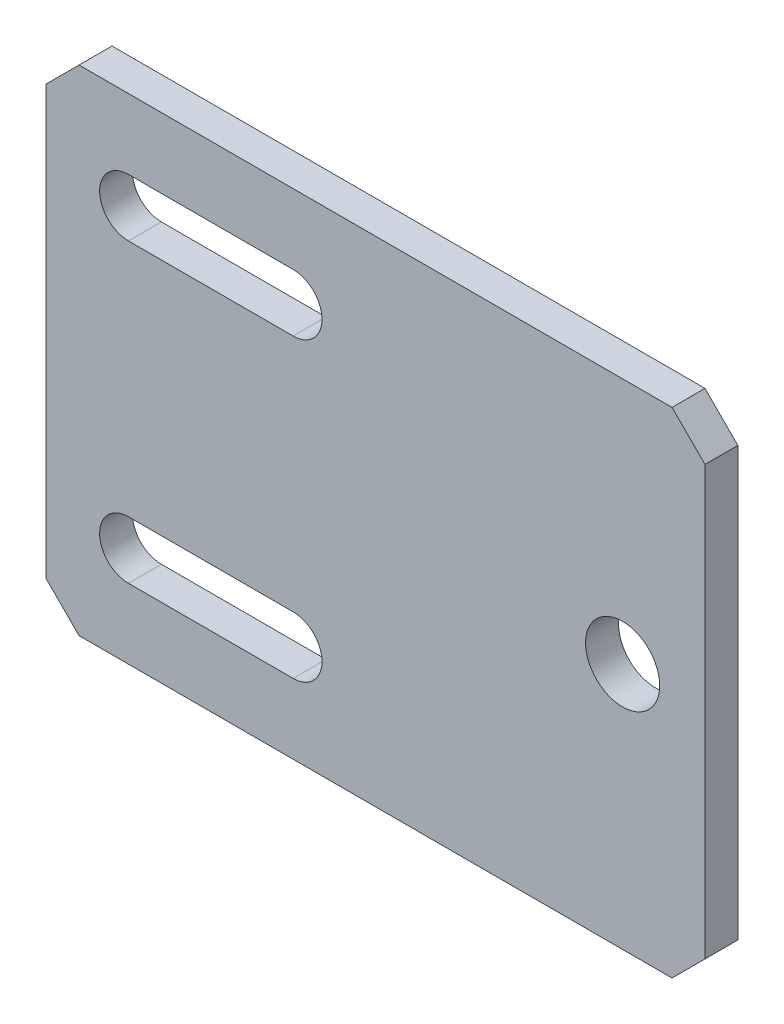
ISO-10303-21;
HEADER;
FILE_DESCRIPTION(('STEP AP214'),'2;1');
FILE_NAME('part.step','',(''),(''),'','','');
FILE_SCHEMA(('AUTOMOTIVE_DESIGN { 1 0 10303 214 1 1 1 1 }'));
ENDSEC;
DATA;
#1=APPLICATION_CONTEXT('core data for automotive mechanical design processes');
#2=APPLICATION_PROTOCOL_DEFINITION('international standard','automotive_design',2000,#1);
#3=PRODUCT_CONTEXT('',#1,'mechanical');
#4=PRODUCT('Part','Part','',(#3));
#5=PRODUCT_RELATED_PRODUCT_CATEGORY('part','',(#4));
#6=PRODUCT_DEFINITION_FORMATION('','',#4);
#7=PRODUCT_DEFINITION_CONTEXT('part definition',#1,'design');
#8=PRODUCT_DEFINITION('design','',#6,#7);
#9=PRODUCT_DEFINITION_SHAPE('','',#8);
#10=(LENGTH_UNIT() NAMED_UNIT(*) SI_UNIT(.MILLI.,.METRE.));
#11=(NAMED_UNIT(*) PLANE_ANGLE_UNIT() SI_UNIT($,.RADIAN.));
#12=(NAMED_UNIT(*) SI_UNIT($,.STERADIAN.) SOLID_ANGLE_UNIT());
#13=UNCERTAINTY_MEASURE_WITH_UNIT(LENGTH_MEASURE(1.E-05),#10,'distance_accuracy_value','');
#14=(GEOMETRIC_REPRESENTATION_CONTEXT(3) GLOBAL_UNCERTAINTY_ASSIGNED_CONTEXT((#13)) GLOBAL_UNIT_ASSIGNED_CONTEXT((#10,
#11,#12)) REPRESENTATION_CONTEXT('',''));
#15=CARTESIAN_POINT('',(0.,0.,0.));
#16=DIRECTION('',(0.,0.,1.));
#17=DIRECTION('',(1.,0.,0.));
#18=AXIS2_PLACEMENT_3D('',#15,#16,#17);
#19=CARTESIAN_POINT('',(0.,0.,2.));
#20=DIRECTION('',(0.,0.,-1.));
#21=DIRECTION('',(-1.,0.,0.));
#22=AXIS2_PLACEMENT_3D('',#19,#20,#21);
#23=PLANE('',#22);
#24=DIRECTION('',(1.,0.,0.));
#25=VECTOR('',#24,1.);
#26=CARTESIAN_POINT('',(0.,0.,2.));
#27=LINE('',#26,#25);
#28=CARTESIAN_POINT('',(2.,0.,2.));
#29=VERTEX_POINT('',#28);
#30=CARTESIAN_POINT('',(38.,0.,2.));
#31=VERTEX_POINT('',#30);
#32=EDGE_CURVE('E224',#29,#31,#27,.T.);
#33=ORIENTED_EDGE('',*,*,#32,.T.);
#34=DIRECTION('',(-0.70710678118655,-0.707106781186545,0.));
#35=VECTOR('',#34,1.);
#36=CARTESIAN_POINT('',(40.,2.,2.));
#37=LINE('',#36,#35);
#38=CARTESIAN_POINT('',(40.,2.,2.));
#39=VERTEX_POINT('',#38);
#40=EDGE_CURVE('E268',#31,#39,#37,.F.);
#41=ORIENTED_EDGE('',*,*,#40,.T.);
#42=DIRECTION('',(0.,1.,0.));
#43=VECTOR('',#42,1.);
#44=CARTESIAN_POINT('',(40.,0.,2.));
#45=LINE('',#44,#43);
#46=CARTESIAN_POINT('',(40.,28.,2.));
#47=VERTEX_POINT('',#46);
#48=EDGE_CURVE('E228',#39,#47,#45,.T.);
#49=ORIENTED_EDGE('',*,*,#48,.T.);
#50=DIRECTION('',(0.707106781186546,-0.707106781186549,0.));
#51=VECTOR('',#50,1.);
#52=CARTESIAN_POINT('',(38.,30.,2.));
#53=LINE('',#52,#51);
#54=CARTESIAN_POINT('',(38.,30.,2.));
#55=VERTEX_POINT('',#54);
#56=EDGE_CURVE('E264',#47,#55,#53,.F.);
#57=ORIENTED_EDGE('',*,*,#56,.T.);
#58=DIRECTION('',(-1.,0.,0.));
#59=VECTOR('',#58,1.);
#60=CARTESIAN_POINT('',(0.,30.,2.));
#61=LINE('',#60,#59);
#62=CARTESIAN_POINT('',(2.00000000000002,30.,2.));
#63=VERTEX_POINT('',#62);
#64=EDGE_CURVE('E231',#55,#63,#61,.T.);
#65=ORIENTED_EDGE('',*,*,#64,.T.);
#66=DIRECTION('',(0.70710678118655,0.707106781186545,0.));
#67=VECTOR('',#66,1.);
#68=CARTESIAN_POINT('',(0.,28.,2.));
#69=LINE('',#68,#67);
#70=CARTESIAN_POINT('',(0.,28.,2.));
#71=VERTEX_POINT('',#70);
#72=EDGE_CURVE('E262',#63,#71,#69,.F.);
#73=ORIENTED_EDGE('',*,*,#72,.T.);
#74=DIRECTION('',(0.,-1.,0.));
#75=VECTOR('',#74,1.);
#76=CARTESIAN_POINT('',(0.,0.,2.));
#77=LINE('',#76,#75);
#78=CARTESIAN_POINT('',(0.,2.00000000000002,2.));
#79=VERTEX_POINT('',#78);
#80=EDGE_CURVE('E221',#71,#79,#77,.T.);
#81=ORIENTED_EDGE('',*,*,#80,.T.);
#82=DIRECTION('',(-0.707106781186545,0.70710678118655,0.));
#83=VECTOR('',#82,1.);
#84=CARTESIAN_POINT('',(2.,0.,2.));
#85=LINE('',#84,#83);
#86=EDGE_CURVE('E266',#79,#29,#85,.F.);
#87=ORIENTED_EDGE('',*,*,#86,.T.);
#88=EDGE_LOOP('',(#33,#41,#49,#57,#65,#73,#81,#87));
#89=FACE_BOUND('',#88,.T.);
#90=DIRECTION('',(1.,0.,0.));
#91=VECTOR('',#90,1.);
#92=CARTESIAN_POINT('',(5.,4.25,2.));
#93=LINE('',#92,#91);
#94=CARTESIAN_POINT('',(5.,4.25,2.));
#95=VERTEX_POINT('',#94);
#96=CARTESIAN_POINT('',(15.,4.25,2.));
#97=VERTEX_POINT('',#96);
#98=EDGE_CURVE('E204',#95,#97,#93,.T.);
#99=ORIENTED_EDGE('',*,*,#98,.F.);
#100=CARTESIAN_POINT('',(5.,6.,2.));
#101=DIRECTION('',(0.,0.,1.));
#102=DIRECTION('',(1.,0.,0.));
#103=AXIS2_PLACEMENT_3D('',#100,#101,#102);
#104=CIRCLE('',#103,1.75);
#105=CARTESIAN_POINT('',(5.,7.75,2.));
#106=VERTEX_POINT('',#105);
#107=EDGE_CURVE('E185',#106,#95,#104,.T.);
#108=ORIENTED_EDGE('',*,*,#107,.F.);
#109=DIRECTION('',(-1.,0.,0.));
#110=VECTOR('',#109,1.);
#111=CARTESIAN_POINT('',(5.,7.75,2.));
#112=LINE('',#111,#110);
#113=CARTESIAN_POINT('',(15.,7.75,2.));
#114=VERTEX_POINT('',#113);
#115=EDGE_CURVE('E193',#114,#106,#112,.T.);
#116=ORIENTED_EDGE('',*,*,#115,.F.);
#117=CARTESIAN_POINT('',(15.,6.,2.));
#118=DIRECTION('',(0.,0.,1.));
#119=DIRECTION('',(1.,0.,0.));
#120=AXIS2_PLACEMENT_3D('',#117,#118,#119);
#121=CIRCLE('',#120,1.75);
#122=EDGE_CURVE('E207',#97,#114,#121,.T.);
#123=ORIENTED_EDGE('',*,*,#122,.F.);
#124=EDGE_LOOP('',(#99,#108,#116,#123));
#125=FACE_BOUND('',#124,.T.);
#126=DIRECTION('',(1.,0.,0.));
#127=VECTOR('',#126,1.);
#128=CARTESIAN_POINT('',(5.,22.25,2.));
#129=LINE('',#128,#127);
#130=CARTESIAN_POINT('',(5.,22.25,2.));
#131=VERTEX_POINT('',#130);
#132=CARTESIAN_POINT('',(15.,22.25,2.));
#133=VERTEX_POINT('',#132);
#134=EDGE_CURVE('E179',#131,#133,#129,.T.);
#135=ORIENTED_EDGE('',*,*,#134,.F.);
#136=CARTESIAN_POINT('',(5.,24.,2.));
#137=DIRECTION('',(0.,0.,1.));
#138=DIRECTION('',(1.,0.,0.));
#139=AXIS2_PLACEMENT_3D('',#136,#137,#138);
#140=CIRCLE('',#139,1.75);
#141=CARTESIAN_POINT('',(5.,25.75,2.));
#142=VERTEX_POINT('',#141);
#143=EDGE_CURVE('E51',#142,#131,#140,.T.);
#144=ORIENTED_EDGE('',*,*,#143,.F.);
#145=DIRECTION('',(-1.,0.,0.));
#146=VECTOR('',#145,1.);
#147=CARTESIAN_POINT('',(5.,25.75,2.));
#148=LINE('',#147,#146);
#149=CARTESIAN_POINT('',(15.,25.75,2.));
#150=VERTEX_POINT('',#149);
#151=EDGE_CURVE('E167',#150,#142,#148,.T.);
#152=ORIENTED_EDGE('',*,*,#151,.F.);
#153=CARTESIAN_POINT('',(15.,24.,2.));
#154=DIRECTION('',(0.,0.,1.));
#155=DIRECTION('',(1.,0.,0.));
#156=AXIS2_PLACEMENT_3D('',#153,#154,#155);
#157=CIRCLE('',#156,1.75);
#158=EDGE_CURVE('E170',#133,#150,#157,.T.);
#159=ORIENTED_EDGE('',*,*,#158,.F.);
#160=EDGE_LOOP('',(#135,#144,#152,#159));
#161=FACE_BOUND('',#160,.T.);
#162=CARTESIAN_POINT('',(35.,15.,2.));
#163=DIRECTION('',(0.,0.,1.));
#164=DIRECTION('',(1.,0.,0.));
#165=AXIS2_PLACEMENT_3D('',#162,#163,#164);
#166=CIRCLE('',#165,2.25);
#167=CARTESIAN_POINT('',(37.25,15.,2.));
#168=VERTEX_POINT('',#167);
#169=EDGE_CURVE('E457',#168,#168,#166,.T.);
#170=ORIENTED_EDGE('',*,*,#169,.F.);
#171=EDGE_LOOP('',(#170));
#172=FACE_BOUND('',#171,.T.);
#173=ADVANCED_FACE('F36',(#89,#125,#161,#172),#23,.F.);
#174=CARTESIAN_POINT('',(0.,0.,0.));
#175=DIRECTION('',(0.,0.,-1.));
#176=DIRECTION('',(-1.,0.,0.));
#177=AXIS2_PLACEMENT_3D('',#174,#175,#176);
#178=PLANE('',#177);
#179=DIRECTION('',(0.,1.,0.));
#180=VECTOR('',#179,1.);
#181=CARTESIAN_POINT('',(40.,0.,0.));
#182=LINE('',#181,#180);
#183=CARTESIAN_POINT('',(40.,2.00000000000002,0.));
#184=VERTEX_POINT('',#183);
#185=CARTESIAN_POINT('',(40.,28.,0.));
#186=VERTEX_POINT('',#185);
#187=EDGE_CURVE('E240',#184,#186,#182,.T.);
#188=ORIENTED_EDGE('',*,*,#187,.F.);
#189=DIRECTION('',(0.70710678118655,0.707106781186545,0.));
#190=VECTOR('',#189,1.);
#191=CARTESIAN_POINT('',(18.9999999999999,-19.,0.));
#192=LINE('',#191,#190);
#193=CARTESIAN_POINT('',(38.,0.,0.));
#194=VERTEX_POINT('',#193);
#195=EDGE_CURVE('E255',#184,#194,#192,.F.);
#196=ORIENTED_EDGE('',*,*,#195,.T.);
#197=DIRECTION('',(1.,0.,0.));
#198=VECTOR('',#197,1.);
#199=CARTESIAN_POINT('',(0.,0.,0.));
#200=LINE('',#199,#198);
#201=CARTESIAN_POINT('',(2.,0.,0.));
#202=VERTEX_POINT('',#201);
#203=EDGE_CURVE('E237',#202,#194,#200,.T.);
#204=ORIENTED_EDGE('',*,*,#203,.F.);
#205=DIRECTION('',(0.707106781186545,-0.70710678118655,0.));
#206=VECTOR('',#205,1.);
#207=CARTESIAN_POINT('',(1.00000000000001,1.,0.));
#208=LINE('',#207,#206);
#209=CARTESIAN_POINT('',(0.,2.00000000000002,0.));
#210=VERTEX_POINT('',#209);
#211=EDGE_CURVE('E253',#202,#210,#208,.F.);
#212=ORIENTED_EDGE('',*,*,#211,.T.);
#213=DIRECTION('',(0.,-1.,0.));
#214=VECTOR('',#213,1.);
#215=CARTESIAN_POINT('',(0.,0.,0.));
#216=LINE('',#215,#214);
#217=CARTESIAN_POINT('',(0.,28.,0.));
#218=VERTEX_POINT('',#217);
#219=EDGE_CURVE('E214',#218,#210,#216,.T.);
#220=ORIENTED_EDGE('',*,*,#219,.F.);
#221=DIRECTION('',(-0.70710678118655,-0.707106781186545,0.));
#222=VECTOR('',#221,1.);
#223=CARTESIAN_POINT('',(-14.,14.0000000000001,0.));
#224=LINE('',#223,#222);
#225=CARTESIAN_POINT('',(2.00000000000002,30.,0.));
#226=VERTEX_POINT('',#225);
#227=EDGE_CURVE('E249',#218,#226,#224,.F.);
#228=ORIENTED_EDGE('',*,*,#227,.T.);
#229=DIRECTION('',(-1.,0.,0.));
#230=VECTOR('',#229,1.);
#231=CARTESIAN_POINT('',(0.,30.,0.));
#232=LINE('',#231,#230);
#233=CARTESIAN_POINT('',(38.,30.,0.));
#234=VERTEX_POINT('',#233);
#235=EDGE_CURVE('E225',#234,#226,#232,.T.);
#236=ORIENTED_EDGE('',*,*,#235,.F.);
#237=DIRECTION('',(-0.707106781186546,0.707106781186549,0.));
#238=VECTOR('',#237,1.);
#239=CARTESIAN_POINT('',(34.0000000000001,34.,0.));
#240=LINE('',#239,#238);
#241=EDGE_CURVE('E251',#234,#186,#240,.F.);
#242=ORIENTED_EDGE('',*,*,#241,.T.);
#243=EDGE_LOOP('',(#188,#196,#204,#212,#220,#228,#236,#242));
#244=FACE_BOUND('',#243,.T.);
#245=CARTESIAN_POINT('',(5.,6.,0.));
#246=DIRECTION('',(0.,0.,1.));
#247=DIRECTION('',(1.,0.,0.));
#248=AXIS2_PLACEMENT_3D('',#245,#246,#247);
#249=CIRCLE('',#248,1.75);
#250=CARTESIAN_POINT('',(5.,7.75,0.));
#251=VERTEX_POINT('',#250);
#252=CARTESIAN_POINT('',(5.,4.25,0.));
#253=VERTEX_POINT('',#252);
#254=EDGE_CURVE('E189',#251,#253,#249,.T.);
#255=ORIENTED_EDGE('',*,*,#254,.T.);
#256=DIRECTION('',(1.,0.,0.));
#257=VECTOR('',#256,1.);
#258=CARTESIAN_POINT('',(5.,4.25,0.));
#259=LINE('',#258,#257);
#260=CARTESIAN_POINT('',(15.,4.25,0.));
#261=VERTEX_POINT('',#260);
#262=EDGE_CURVE('E192',#253,#261,#259,.T.);
#263=ORIENTED_EDGE('',*,*,#262,.T.);
#264=CARTESIAN_POINT('',(15.,6.,0.));
#265=DIRECTION('',(0.,0.,1.));
#266=DIRECTION('',(1.,0.,0.));
#267=AXIS2_PLACEMENT_3D('',#264,#265,#266);
#268=CIRCLE('',#267,1.75);
#269=CARTESIAN_POINT('',(15.,7.75,0.));
#270=VERTEX_POINT('',#269);
#271=EDGE_CURVE('E196',#261,#270,#268,.T.);
#272=ORIENTED_EDGE('',*,*,#271,.T.);
#273=DIRECTION('',(-1.,0.,0.));
#274=VECTOR('',#273,1.);
#275=CARTESIAN_POINT('',(5.,7.75,0.));
#276=LINE('',#275,#274);
#277=EDGE_CURVE('E199',#270,#251,#276,.T.);
#278=ORIENTED_EDGE('',*,*,#277,.T.);
#279=EDGE_LOOP('',(#255,#263,#272,#278));
#280=FACE_BOUND('',#279,.T.);
#281=CARTESIAN_POINT('',(5.,24.,0.));
#282=DIRECTION('',(0.,0.,1.));
#283=DIRECTION('',(1.,0.,0.));
#284=AXIS2_PLACEMENT_3D('',#281,#282,#283);
#285=CIRCLE('',#284,1.75);
#286=CARTESIAN_POINT('',(5.,25.75,0.));
#287=VERTEX_POINT('',#286);
#288=CARTESIAN_POINT('',(5.,22.25,0.));
#289=VERTEX_POINT('',#288);
#290=EDGE_CURVE('E151',#287,#289,#285,.T.);
#291=ORIENTED_EDGE('',*,*,#290,.T.);
#292=DIRECTION('',(1.,0.,0.));
#293=VECTOR('',#292,1.);
#294=CARTESIAN_POINT('',(5.,22.25,0.));
#295=LINE('',#294,#293);
#296=CARTESIAN_POINT('',(15.,22.25,0.));
#297=VERTEX_POINT('',#296);
#298=EDGE_CURVE('E160',#289,#297,#295,.T.);
#299=ORIENTED_EDGE('',*,*,#298,.T.);
#300=CARTESIAN_POINT('',(15.,24.,0.));
#301=DIRECTION('',(0.,0.,1.));
#302=DIRECTION('',(1.,0.,0.));
#303=AXIS2_PLACEMENT_3D('',#300,#301,#302);
#304=CIRCLE('',#303,1.75);
#305=CARTESIAN_POINT('',(15.,25.75,0.));
#306=VERTEX_POINT('',#305);
#307=EDGE_CURVE('E59',#297,#306,#304,.T.);
#308=ORIENTED_EDGE('',*,*,#307,.T.);
#309=DIRECTION('',(-1.,0.,0.));
#310=VECTOR('',#309,1.);
#311=CARTESIAN_POINT('',(5.,25.75,0.));
#312=LINE('',#311,#310);
#313=EDGE_CURVE('E157',#306,#287,#312,.T.);
#314=ORIENTED_EDGE('',*,*,#313,.T.);
#315=EDGE_LOOP('',(#291,#299,#308,#314));
#316=FACE_BOUND('',#315,.T.);
#317=CARTESIAN_POINT('',(35.,15.,0.));
#318=DIRECTION('',(0.,0.,1.));
#319=DIRECTION('',(1.,0.,0.));
#320=AXIS2_PLACEMENT_3D('',#317,#318,#319);
#321=CIRCLE('',#320,2.25);
#322=CARTESIAN_POINT('',(37.25,15.,0.));
#323=VERTEX_POINT('',#322);
#324=EDGE_CURVE('E173',#323,#323,#321,.T.);
#325=ORIENTED_EDGE('',*,*,#324,.T.);
#326=EDGE_LOOP('',(#325));
#327=FACE_BOUND('',#326,.T.);
#328=ADVANCED_FACE('F164',(#244,#280,#316,#327),#178,.T.);
#329=CARTESIAN_POINT('',(0.,0.,2.));
#330=DIRECTION('',(1.,0.,0.));
#331=DIRECTION('',(0.,0.,-1.));
#332=AXIS2_PLACEMENT_3D('',#329,#330,#331);
#333=PLANE('',#332);
#334=ORIENTED_EDGE('',*,*,#219,.T.);
#335=DIRECTION('',(0.,0.,1.));
#336=VECTOR('',#335,1.);
#337=CARTESIAN_POINT('',(0.,2.00000000000002,2.));
#338=LINE('',#337,#336);
#339=EDGE_CURVE('E273',#210,#79,#338,.T.);
#340=ORIENTED_EDGE('',*,*,#339,.T.);
#341=ORIENTED_EDGE('',*,*,#80,.F.);
#342=DIRECTION('',(0.,0.,-1.));
#343=VECTOR('',#342,1.);
#344=CARTESIAN_POINT('',(0.,28.,2.));
#345=LINE('',#344,#343);
#346=EDGE_CURVE('E270',#71,#218,#345,.T.);
#347=ORIENTED_EDGE('',*,*,#346,.T.);
#348=EDGE_LOOP('',(#334,#340,#341,#347));
#349=FACE_BOUND('',#348,.T.);
#350=ADVANCED_FACE('F289',(#349),#333,.F.);
#351=CARTESIAN_POINT('',(0.,0.,2.));
#352=DIRECTION('',(0.,1.,0.));
#353=DIRECTION('',(0.,0.,1.));
#354=AXIS2_PLACEMENT_3D('',#351,#352,#353);
#355=PLANE('',#354);
#356=ORIENTED_EDGE('',*,*,#203,.T.);
#357=DIRECTION('',(0.,0.,1.));
#358=VECTOR('',#357,1.);
#359=CARTESIAN_POINT('',(38.,0.,2.));
#360=LINE('',#359,#358);
#361=EDGE_CURVE('E260',#194,#31,#360,.T.);
#362=ORIENTED_EDGE('',*,*,#361,.T.);
#363=ORIENTED_EDGE('',*,*,#32,.F.);
#364=DIRECTION('',(0.,0.,-1.));
#365=VECTOR('',#364,1.);
#366=CARTESIAN_POINT('',(2.,0.,2.));
#367=LINE('',#366,#365);
#368=EDGE_CURVE('E257',#29,#202,#367,.T.);
#369=ORIENTED_EDGE('',*,*,#368,.T.);
#370=EDGE_LOOP('',(#356,#362,#363,#369));
#371=FACE_BOUND('',#370,.T.);
#372=ADVANCED_FACE('F301',(#371),#355,.F.);
#373=CARTESIAN_POINT('',(40.,0.,2.));
#374=DIRECTION('',(-1.,0.,0.));
#375=DIRECTION('',(0.,0.,1.));
#376=AXIS2_PLACEMENT_3D('',#373,#374,#375);
#377=PLANE('',#376);
#378=ORIENTED_EDGE('',*,*,#48,.F.);
#379=DIRECTION('',(0.,0.,-1.));
#380=VECTOR('',#379,1.);
#381=CARTESIAN_POINT('',(40.,2.,2.));
#382=LINE('',#381,#380);
#383=EDGE_CURVE('E246',#39,#184,#382,.T.);
#384=ORIENTED_EDGE('',*,*,#383,.T.);
#385=ORIENTED_EDGE('',*,*,#187,.T.);
#386=DIRECTION('',(0.,0.,1.));
#387=VECTOR('',#386,1.);
#388=CARTESIAN_POINT('',(40.,28.,2.));
#389=LINE('',#388,#387);
#390=EDGE_CURVE('E234',#186,#47,#389,.T.);
#391=ORIENTED_EDGE('',*,*,#390,.T.);
#392=EDGE_LOOP('',(#378,#384,#385,#391));
#393=FACE_BOUND('',#392,.T.);
#394=ADVANCED_FACE('F309',(#393),#377,.F.);
#395=CARTESIAN_POINT('',(0.,30.,2.));
#396=DIRECTION('',(0.,-1.,0.));
#397=DIRECTION('',(0.,0.,-1.));
#398=AXIS2_PLACEMENT_3D('',#395,#396,#397);
#399=PLANE('',#398);
#400=ORIENTED_EDGE('',*,*,#64,.F.);
#401=DIRECTION('',(0.,0.,-1.));
#402=VECTOR('',#401,1.);
#403=CARTESIAN_POINT('',(38.,30.,2.));
#404=LINE('',#403,#402);
#405=EDGE_CURVE('E11',#55,#234,#404,.T.);
#406=ORIENTED_EDGE('',*,*,#405,.T.);
#407=ORIENTED_EDGE('',*,*,#235,.T.);
#408=DIRECTION('',(0.,0.,1.));
#409=VECTOR('',#408,1.);
#410=CARTESIAN_POINT('',(2.00000000000002,30.,2.));
#411=LINE('',#410,#409);
#412=EDGE_CURVE('E44',#226,#63,#411,.T.);
#413=ORIENTED_EDGE('',*,*,#412,.T.);
#414=EDGE_LOOP('',(#400,#406,#407,#413));
#415=FACE_BOUND('',#414,.T.);
#416=ADVANCED_FACE('F277',(#415),#399,.F.);
#417=CARTESIAN_POINT('',(40.,2.,2.));
#418=DIRECTION('',(-0.707106781186545,0.70710678118655,0.));
#419=DIRECTION('',(0.,0.,-1.));
#420=AXIS2_PLACEMENT_3D('',#417,#418,#419);
#421=PLANE('',#420);
#422=ORIENTED_EDGE('',*,*,#40,.F.);
#423=ORIENTED_EDGE('',*,*,#361,.F.);
#424=ORIENTED_EDGE('',*,*,#195,.F.);
#425=ORIENTED_EDGE('',*,*,#383,.F.);
#426=EDGE_LOOP('',(#422,#423,#424,#425));
#427=FACE_BOUND('',#426,.T.);
#428=ADVANCED_FACE('F307',(#427),#421,.F.);
#429=CARTESIAN_POINT('',(2.,0.,2.));
#430=DIRECTION('',(0.70710678118655,0.707106781186545,0.));
#431=DIRECTION('',(0.,0.,-1.));
#432=AXIS2_PLACEMENT_3D('',#429,#430,#431);
#433=PLANE('',#432);
#434=ORIENTED_EDGE('',*,*,#86,.F.);
#435=ORIENTED_EDGE('',*,*,#339,.F.);
#436=ORIENTED_EDGE('',*,*,#211,.F.);
#437=ORIENTED_EDGE('',*,*,#368,.F.);
#438=EDGE_LOOP('',(#434,#435,#436,#437));
#439=FACE_BOUND('',#438,.T.);
#440=ADVANCED_FACE('F298',(#439),#433,.F.);
#441=CARTESIAN_POINT('',(38.,30.,2.));
#442=DIRECTION('',(-0.707106781186549,-0.707106781186546,0.));
#443=DIRECTION('',(0.,0.,-1.));
#444=AXIS2_PLACEMENT_3D('',#441,#442,#443);
#445=PLANE('',#444);
#446=ORIENTED_EDGE('',*,*,#56,.F.);
#447=ORIENTED_EDGE('',*,*,#390,.F.);
#448=ORIENTED_EDGE('',*,*,#241,.F.);
#449=ORIENTED_EDGE('',*,*,#405,.F.);
#450=EDGE_LOOP('',(#446,#447,#448,#449));
#451=FACE_BOUND('',#450,.T.);
#452=ADVANCED_FACE('F312',(#451),#445,.F.);
#453=CARTESIAN_POINT('',(0.,28.,2.));
#454=DIRECTION('',(0.707106781186545,-0.70710678118655,0.));
#455=DIRECTION('',(0.,0.,-1.));
#456=AXIS2_PLACEMENT_3D('',#453,#454,#455);
#457=PLANE('',#456);
#458=ORIENTED_EDGE('',*,*,#72,.F.);
#459=ORIENTED_EDGE('',*,*,#412,.F.);
#460=ORIENTED_EDGE('',*,*,#227,.F.);
#461=ORIENTED_EDGE('',*,*,#346,.F.);
#462=EDGE_LOOP('',(#458,#459,#460,#461));
#463=FACE_BOUND('',#462,.T.);
#464=ADVANCED_FACE('F38',(#463),#457,.F.);
#465=CARTESIAN_POINT('',(5.,6.,0.));
#466=DIRECTION('',(0.,0.,1.));
#467=DIRECTION('',(1.,0.,0.));
#468=AXIS2_PLACEMENT_3D('',#465,#466,#467);
#469=CYLINDRICAL_SURFACE('',#468,1.75);
#470=ORIENTED_EDGE('',*,*,#107,.T.);
#471=DIRECTION('',(0.,0.,1.));
#472=VECTOR('',#471,1.);
#473=CARTESIAN_POINT('',(5.,4.25,0.));
#474=LINE('',#473,#472);
#475=EDGE_CURVE('E202',#253,#95,#474,.T.);
#476=ORIENTED_EDGE('',*,*,#475,.F.);
#477=ORIENTED_EDGE('',*,*,#254,.F.);
#478=DIRECTION('',(0.,0.,1.));
#479=VECTOR('',#478,1.);
#480=CARTESIAN_POINT('',(5.,7.75,0.));
#481=LINE('',#480,#479);
#482=EDGE_CURVE('E212',#251,#106,#481,.T.);
#483=ORIENTED_EDGE('',*,*,#482,.T.);
#484=EDGE_LOOP('',(#470,#476,#477,#483));
#485=FACE_BOUND('',#484,.T.);
#486=ADVANCED_FACE('F318',(#485),#469,.F.);
#487=CARTESIAN_POINT('',(5.,7.75,0.));
#488=DIRECTION('',(0.,1.,0.));
#489=DIRECTION('',(-1.,0.,0.));
#490=AXIS2_PLACEMENT_3D('',#487,#488,#489);
#491=PLANE('',#490);
#492=ORIENTED_EDGE('',*,*,#115,.T.);
#493=ORIENTED_EDGE('',*,*,#482,.F.);
#494=ORIENTED_EDGE('',*,*,#277,.F.);
#495=DIRECTION('',(0.,0.,1.));
#496=VECTOR('',#495,1.);
#497=CARTESIAN_POINT('',(15.,7.75,0.));
#498=LINE('',#497,#496);
#499=EDGE_CURVE('E215',#270,#114,#498,.T.);
#500=ORIENTED_EDGE('',*,*,#499,.T.);
#501=EDGE_LOOP('',(#492,#493,#494,#500));
#502=FACE_BOUND('',#501,.T.);
#503=ADVANCED_FACE('F365',(#502),#491,.F.);
#504=CARTESIAN_POINT('',(15.,6.,0.));
#505=DIRECTION('',(0.,0.,1.));
#506=DIRECTION('',(1.,0.,0.));
#507=AXIS2_PLACEMENT_3D('',#504,#505,#506);
#508=CYLINDRICAL_SURFACE('',#507,1.75);
#509=ORIENTED_EDGE('',*,*,#122,.T.);
#510=ORIENTED_EDGE('',*,*,#499,.F.);
#511=ORIENTED_EDGE('',*,*,#271,.F.);
#512=DIRECTION('',(0.,0.,1.));
#513=VECTOR('',#512,1.);
#514=CARTESIAN_POINT('',(15.,4.25,0.));
#515=LINE('',#514,#513);
#516=EDGE_CURVE('E217',#261,#97,#515,.T.);
#517=ORIENTED_EDGE('',*,*,#516,.T.);
#518=EDGE_LOOP('',(#509,#510,#511,#517));
#519=FACE_BOUND('',#518,.T.);
#520=ADVANCED_FACE('F374',(#519),#508,.F.);
#521=CARTESIAN_POINT('',(5.,4.25,0.));
#522=DIRECTION('',(0.,-1.,0.));
#523=DIRECTION('',(1.,0.,0.));
#524=AXIS2_PLACEMENT_3D('',#521,#522,#523);
#525=PLANE('',#524);
#526=ORIENTED_EDGE('',*,*,#98,.T.);
#527=ORIENTED_EDGE('',*,*,#516,.F.);
#528=ORIENTED_EDGE('',*,*,#262,.F.);
#529=ORIENTED_EDGE('',*,*,#475,.T.);
#530=EDGE_LOOP('',(#526,#527,#528,#529));
#531=FACE_BOUND('',#530,.T.);
#532=ADVANCED_FACE('F384',(#531),#525,.F.);
#533=CARTESIAN_POINT('',(5.,24.,0.));
#534=DIRECTION('',(0.,0.,1.));
#535=DIRECTION('',(1.,0.,0.));
#536=AXIS2_PLACEMENT_3D('',#533,#534,#535);
#537=CYLINDRICAL_SURFACE('',#536,1.75);
#538=ORIENTED_EDGE('',*,*,#143,.T.);
#539=DIRECTION('',(0.,0.,1.));
#540=VECTOR('',#539,1.);
#541=CARTESIAN_POINT('',(5.,22.25,0.));
#542=LINE('',#541,#540);
#543=EDGE_CURVE('E147',#289,#131,#542,.T.);
#544=ORIENTED_EDGE('',*,*,#543,.F.);
#545=ORIENTED_EDGE('',*,*,#290,.F.);
#546=DIRECTION('',(0.,0.,1.));
#547=VECTOR('',#546,1.);
#548=CARTESIAN_POINT('',(5.,25.75,0.));
#549=LINE('',#548,#547);
#550=EDGE_CURVE('E183',#287,#142,#549,.T.);
#551=ORIENTED_EDGE('',*,*,#550,.T.);
#552=EDGE_LOOP('',(#538,#544,#545,#551));
#553=FACE_BOUND('',#552,.T.);
#554=ADVANCED_FACE('F149',(#553),#537,.F.);
#555=CARTESIAN_POINT('',(5.,25.75,0.));
#556=DIRECTION('',(0.,1.,0.));
#557=DIRECTION('',(-1.,0.,0.));
#558=AXIS2_PLACEMENT_3D('',#555,#556,#557);
#559=PLANE('',#558);
#560=ORIENTED_EDGE('',*,*,#151,.T.);
#561=ORIENTED_EDGE('',*,*,#550,.F.);
#562=ORIENTED_EDGE('',*,*,#313,.F.);
#563=DIRECTION('',(0.,0.,1.));
#564=VECTOR('',#563,1.);
#565=CARTESIAN_POINT('',(15.,25.75,0.));
#566=LINE('',#565,#564);
#567=EDGE_CURVE('E186',#306,#150,#566,.T.);
#568=ORIENTED_EDGE('',*,*,#567,.T.);
#569=EDGE_LOOP('',(#560,#561,#562,#568));
#570=FACE_BOUND('',#569,.T.);
#571=ADVANCED_FACE('F402',(#570),#559,.F.);
#572=CARTESIAN_POINT('',(15.,24.,0.));
#573=DIRECTION('',(0.,0.,1.));
#574=DIRECTION('',(1.,0.,0.));
#575=AXIS2_PLACEMENT_3D('',#572,#573,#574);
#576=CYLINDRICAL_SURFACE('',#575,1.75);
#577=ORIENTED_EDGE('',*,*,#158,.T.);
#578=ORIENTED_EDGE('',*,*,#567,.F.);
#579=ORIENTED_EDGE('',*,*,#307,.F.);
#580=DIRECTION('',(0.,0.,1.));
#581=VECTOR('',#580,1.);
#582=CARTESIAN_POINT('',(15.,22.25,0.));
#583=LINE('',#582,#581);
#584=EDGE_CURVE('E156',#297,#133,#583,.T.);
#585=ORIENTED_EDGE('',*,*,#584,.T.);
#586=EDGE_LOOP('',(#577,#578,#579,#585));
#587=FACE_BOUND('',#586,.T.);
#588=ADVANCED_FACE('F411',(#587),#576,.F.);
#589=CARTESIAN_POINT('',(5.,22.25,0.));
#590=DIRECTION('',(0.,-1.,0.));
#591=DIRECTION('',(1.,0.,0.));
#592=AXIS2_PLACEMENT_3D('',#589,#590,#591);
#593=PLANE('',#592);
#594=ORIENTED_EDGE('',*,*,#134,.T.);
#595=ORIENTED_EDGE('',*,*,#584,.F.);
#596=ORIENTED_EDGE('',*,*,#298,.F.);
#597=ORIENTED_EDGE('',*,*,#543,.T.);
#598=EDGE_LOOP('',(#594,#595,#596,#597));
#599=FACE_BOUND('',#598,.T.);
#600=ADVANCED_FACE('F161',(#599),#593,.F.);
#601=CARTESIAN_POINT('',(35.,15.,2.));
#602=DIRECTION('',(0.,0.,1.));
#603=DIRECTION('',(1.,0.,0.));
#604=AXIS2_PLACEMENT_3D('',#601,#602,#603);
#605=CYLINDRICAL_SURFACE('',#604,2.25);
#606=ORIENTED_EDGE('',*,*,#324,.F.);
#607=EDGE_LOOP('',(#606));
#608=FACE_BOUND('',#607,.T.);
#609=ORIENTED_EDGE('',*,*,#169,.T.);
#610=EDGE_LOOP('',(#609));
#611=FACE_BOUND('',#610,.T.);
#612=ADVANCED_FACE('F428',(#608,#611),#605,.F.);
#613=CLOSED_SHELL('',(#173,#328,#350,#372,#394,#416,#428,#440,#452,#464,#486,#503,#520,#532,
#554,#571,#588,#600,#612));
#614=MANIFOLD_SOLID_BREP('B2',#613);
#615=ADVANCED_BREP_SHAPE_REPRESENTATION('',(#18,#614),#14);
#616=SHAPE_DEFINITION_REPRESENTATION(#9,#615);
ENDSEC;
END-ISO-10303-21;
